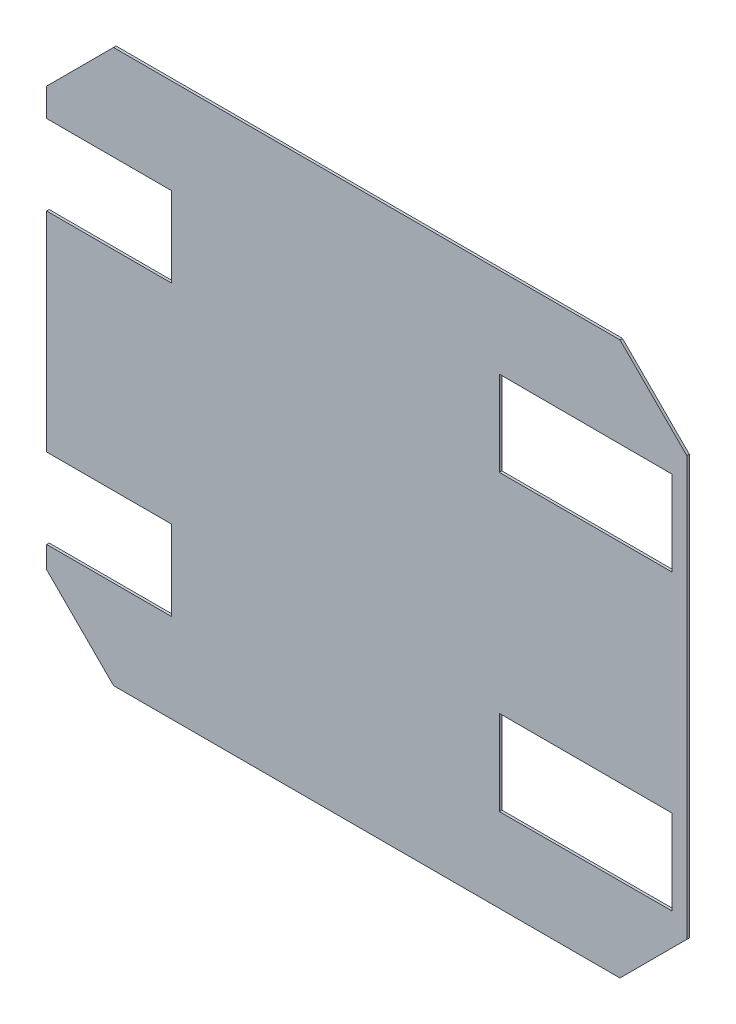
ISO-10303-21;
HEADER;
FILE_DESCRIPTION(('STEP AP214'),'2;1');
FILE_NAME('part.step','',(''),(''),'','','');
FILE_SCHEMA(('AUTOMOTIVE_DESIGN { 1 0 10303 214 1 1 1 1 }'));
ENDSEC;
DATA;
#1=APPLICATION_CONTEXT('core data for automotive mechanical design processes');
#2=APPLICATION_PROTOCOL_DEFINITION('international standard','automotive_design',2000,#1);
#3=PRODUCT_CONTEXT('',#1,'mechanical');
#4=PRODUCT('Part','Part','',(#3));
#5=PRODUCT_RELATED_PRODUCT_CATEGORY('part','',(#4));
#6=PRODUCT_DEFINITION_FORMATION('','',#4);
#7=PRODUCT_DEFINITION_CONTEXT('part definition',#1,'design');
#8=PRODUCT_DEFINITION('design','',#6,#7);
#9=PRODUCT_DEFINITION_SHAPE('','',#8);
#10=(LENGTH_UNIT() NAMED_UNIT(*) SI_UNIT(.MILLI.,.METRE.));
#11=(NAMED_UNIT(*) PLANE_ANGLE_UNIT() SI_UNIT($,.RADIAN.));
#12=(NAMED_UNIT(*) SI_UNIT($,.STERADIAN.) SOLID_ANGLE_UNIT());
#13=UNCERTAINTY_MEASURE_WITH_UNIT(LENGTH_MEASURE(1.E-05),#10,'distance_accuracy_value','');
#14=(GEOMETRIC_REPRESENTATION_CONTEXT(3) GLOBAL_UNCERTAINTY_ASSIGNED_CONTEXT((#13)) GLOBAL_UNIT_ASSIGNED_CONTEXT((#10,
#11,#12)) REPRESENTATION_CONTEXT('',''));
#15=CARTESIAN_POINT('',(0.,0.,0.));
#16=DIRECTION('',(0.,0.,1.));
#17=DIRECTION('',(1.,0.,0.));
#18=AXIS2_PLACEMENT_3D('',#15,#16,#17);
#19=CARTESIAN_POINT('',(110.112019193253,0.,2.));
#20=DIRECTION('',(-1.,0.,0.));
#21=DIRECTION('',(0.,-1.,0.));
#22=AXIS2_PLACEMENT_3D('',#19,#20,#21);
#23=PLANE('',#22);
#24=DIRECTION('',(0.,1.,0.));
#25=VECTOR('',#24,1.);
#26=CARTESIAN_POINT('',(110.112019193253,0.,0.));
#27=LINE('',#26,#25);
#28=CARTESIAN_POINT('',(110.112019193254,-113.938398775915,0.));
#29=VERTEX_POINT('',#28);
#30=CARTESIAN_POINT('',(110.112019193253,-46.168159055037,0.));
#31=VERTEX_POINT('',#30);
#32=EDGE_CURVE('E347',#29,#31,#27,.T.);
#33=ORIENTED_EDGE('',*,*,#32,.F.);
#34=DIRECTION('',(0.,0.,-1.));
#35=VECTOR('',#34,1.);
#36=CARTESIAN_POINT('',(110.112019193254,-113.938398775915,2.));
#37=LINE('',#36,#35);
#38=CARTESIAN_POINT('',(110.112019193254,-113.938398775915,2.));
#39=VERTEX_POINT('',#38);
#40=EDGE_CURVE('E11',#39,#29,#37,.T.);
#41=ORIENTED_EDGE('',*,*,#40,.F.);
#42=DIRECTION('',(0.,1.,0.));
#43=VECTOR('',#42,1.);
#44=CARTESIAN_POINT('',(110.112019193253,0.,2.));
#45=LINE('',#44,#43);
#46=CARTESIAN_POINT('',(110.112019193253,-46.168159055037,2.));
#47=VERTEX_POINT('',#46);
#48=EDGE_CURVE('E226',#39,#47,#45,.T.);
#49=ORIENTED_EDGE('',*,*,#48,.T.);
#50=DIRECTION('',(0.,0.,-1.));
#51=VECTOR('',#50,1.);
#52=CARTESIAN_POINT('',(110.112019193253,-46.168159055037,2.));
#53=LINE('',#52,#51);
#54=EDGE_CURVE('E144',#47,#31,#53,.T.);
#55=ORIENTED_EDGE('',*,*,#54,.T.);
#56=EDGE_LOOP('',(#33,#41,#49,#55));
#57=FACE_BOUND('',#56,.T.);
#58=ADVANCED_FACE('F43',(#57),#23,.T.);
#59=CARTESIAN_POINT('',(0.190004110785535,-114.121411187995,2.));
#60=DIRECTION('',(0.00166492725127887,-0.999998614007664,0.));
#61=DIRECTION('',(0.999998614007664,0.00166492725127887,0.));
#62=AXIS2_PLACEMENT_3D('',#59,#60,#61);
#63=PLANE('',#62);
#64=DIRECTION('',(-0.999998614007663,-0.00166492725127887,0.));
#65=VECTOR('',#64,1.);
#66=CARTESIAN_POINT('',(0.190004110785535,-114.121411187995,0.));
#67=LINE('',#66,#65);
#68=CARTESIAN_POINT('',(-27.8879808067465,-114.168159055037,0.));
#69=VERTEX_POINT('',#68);
#70=EDGE_CURVE('E231',#29,#69,#67,.T.);
#71=ORIENTED_EDGE('',*,*,#70,.T.);
#72=DIRECTION('',(0.,0.,-1.));
#73=VECTOR('',#72,1.);
#74=CARTESIAN_POINT('',(-27.8879808067465,-114.168159055037,2.));
#75=LINE('',#74,#73);
#76=CARTESIAN_POINT('',(-27.8879808067465,-114.168159055037,2.));
#77=VERTEX_POINT('',#76);
#78=EDGE_CURVE('E53',#77,#69,#75,.T.);
#79=ORIENTED_EDGE('',*,*,#78,.F.);
#80=DIRECTION('',(-0.999998614007663,-0.00166492725127887,0.));
#81=VECTOR('',#80,1.);
#82=CARTESIAN_POINT('',(0.190004110785535,-114.121411187995,2.));
#83=LINE('',#82,#81);
#84=EDGE_CURVE('E222',#39,#77,#83,.T.);
#85=ORIENTED_EDGE('',*,*,#84,.F.);
#86=ORIENTED_EDGE('',*,*,#40,.T.);
#87=EDGE_LOOP('',(#71,#79,#85,#86));
#88=FACE_BOUND('',#87,.T.);
#89=ADVANCED_FACE('F229',(#88),#63,.F.);
#90=CARTESIAN_POINT('',(-27.8879808067464,0.,2.));
#91=DIRECTION('',(-1.,0.,0.));
#92=DIRECTION('',(0.,-1.,0.));
#93=AXIS2_PLACEMENT_3D('',#90,#91,#92);
#94=PLANE('',#93);
#95=DIRECTION('',(0.,1.,0.));
#96=VECTOR('',#95,1.);
#97=CARTESIAN_POINT('',(-27.8879808067464,0.,0.));
#98=LINE('',#97,#96);
#99=CARTESIAN_POINT('',(-27.8879808067464,-46.168159055037,0.));
#100=VERTEX_POINT('',#99);
#101=EDGE_CURVE('E350',#69,#100,#98,.T.);
#102=ORIENTED_EDGE('',*,*,#101,.T.);
#103=DIRECTION('',(0.,0.,-1.));
#104=VECTOR('',#103,1.);
#105=CARTESIAN_POINT('',(-27.8879808067464,-46.168159055037,2.));
#106=LINE('',#105,#104);
#107=CARTESIAN_POINT('',(-27.8879808067464,-46.168159055037,2.));
#108=VERTEX_POINT('',#107);
#109=EDGE_CURVE('E221',#108,#100,#106,.T.);
#110=ORIENTED_EDGE('',*,*,#109,.F.);
#111=DIRECTION('',(0.,1.,0.));
#112=VECTOR('',#111,1.);
#113=CARTESIAN_POINT('',(-27.8879808067464,0.,2.));
#114=LINE('',#113,#112);
#115=EDGE_CURVE('E215',#77,#108,#114,.T.);
#116=ORIENTED_EDGE('',*,*,#115,.F.);
#117=ORIENTED_EDGE('',*,*,#78,.T.);
#118=EDGE_LOOP('',(#102,#110,#116,#117));
#119=FACE_BOUND('',#118,.T.);
#120=ADVANCED_FACE('F218',(#119),#94,.F.);
#121=CARTESIAN_POINT('',(0.314223050023848,188.730537188184,2.));
#122=DIRECTION('',(-0.00166492725127887,-0.999998614007664,0.));
#123=DIRECTION('',(0.999998614007664,-0.00166492725127887,0.));
#124=AXIS2_PLACEMENT_3D('',#121,#122,#123);
#125=PLANE('',#124);
#126=DIRECTION('',(-0.999998614007663,0.00166492725127887,0.));
#127=VECTOR('',#126,1.);
#128=CARTESIAN_POINT('',(0.314223050023848,188.730537188184,0.));
#129=LINE('',#128,#127);
#130=CARTESIAN_POINT('',(110.112019193254,188.547731591888,0.));
#131=VERTEX_POINT('',#130);
#132=CARTESIAN_POINT('',(-27.8879808067465,188.77749187101,0.));
#133=VERTEX_POINT('',#132);
#134=EDGE_CURVE('E335',#131,#133,#129,.T.);
#135=ORIENTED_EDGE('',*,*,#134,.F.);
#136=DIRECTION('',(0.,0.,-1.));
#137=VECTOR('',#136,1.);
#138=CARTESIAN_POINT('',(110.112019193254,188.547731591888,2.));
#139=LINE('',#138,#137);
#140=CARTESIAN_POINT('',(110.112019193254,188.547731591888,2.));
#141=VERTEX_POINT('',#140);
#142=EDGE_CURVE('E242',#141,#131,#139,.T.);
#143=ORIENTED_EDGE('',*,*,#142,.F.);
#144=DIRECTION('',(-0.999998614007663,0.00166492725127887,0.));
#145=VECTOR('',#144,1.);
#146=CARTESIAN_POINT('',(0.314223050023848,188.730537188184,2.));
#147=LINE('',#146,#145);
#148=CARTESIAN_POINT('',(-27.8879808067465,188.77749187101,2.));
#149=VERTEX_POINT('',#148);
#150=EDGE_CURVE('E387',#141,#149,#147,.T.);
#151=ORIENTED_EDGE('',*,*,#150,.T.);
#152=DIRECTION('',(0.,0.,-1.));
#153=VECTOR('',#152,1.);
#154=CARTESIAN_POINT('',(-27.8879808067465,188.77749187101,2.));
#155=LINE('',#154,#153);
#156=EDGE_CURVE('E236',#149,#133,#155,.T.);
#157=ORIENTED_EDGE('',*,*,#156,.T.);
#158=EDGE_LOOP('',(#135,#143,#151,#157));
#159=FACE_BOUND('',#158,.T.);
#160=ADVANCED_FACE('F428',(#159),#125,.T.);
#161=CARTESIAN_POINT('',(110.112019193253,0.,2.));
#162=DIRECTION('',(1.,0.,0.));
#163=DIRECTION('',(0.,1.,0.));
#164=AXIS2_PLACEMENT_3D('',#161,#162,#163);
#165=PLANE('',#164);
#166=DIRECTION('',(0.,-1.,0.));
#167=VECTOR('',#166,1.);
#168=CARTESIAN_POINT('',(110.112019193253,0.,0.));
#169=LINE('',#168,#167);
#170=CARTESIAN_POINT('',(110.112019193253,120.77749187101,0.));
#171=VERTEX_POINT('',#170);
#172=EDGE_CURVE('E338',#131,#171,#169,.T.);
#173=ORIENTED_EDGE('',*,*,#172,.T.);
#174=DIRECTION('',(0.,0.,-1.));
#175=VECTOR('',#174,1.);
#176=CARTESIAN_POINT('',(110.112019193253,120.77749187101,2.));
#177=LINE('',#176,#175);
#178=CARTESIAN_POINT('',(110.112019193253,120.77749187101,2.));
#179=VERTEX_POINT('',#178);
#180=EDGE_CURVE('E240',#179,#171,#177,.T.);
#181=ORIENTED_EDGE('',*,*,#180,.F.);
#182=DIRECTION('',(0.,-1.,0.));
#183=VECTOR('',#182,1.);
#184=CARTESIAN_POINT('',(110.112019193253,0.,2.));
#185=LINE('',#184,#183);
#186=EDGE_CURVE('E390',#141,#179,#185,.T.);
#187=ORIENTED_EDGE('',*,*,#186,.F.);
#188=ORIENTED_EDGE('',*,*,#142,.T.);
#189=EDGE_LOOP('',(#173,#181,#187,#188));
#190=FACE_BOUND('',#189,.T.);
#191=ADVANCED_FACE('F425',(#190),#165,.F.);
#192=CARTESIAN_POINT('',(0.,120.77749187101,2.));
#193=DIRECTION('',(0.,1.,0.));
#194=DIRECTION('',(-1.,0.,0.));
#195=AXIS2_PLACEMENT_3D('',#192,#193,#194);
#196=PLANE('',#195);
#197=DIRECTION('',(1.,0.,0.));
#198=VECTOR('',#197,1.);
#199=CARTESIAN_POINT('',(0.,120.77749187101,0.));
#200=LINE('',#199,#198);
#201=CARTESIAN_POINT('',(-27.8879808067464,120.77749187101,0.));
#202=VERTEX_POINT('',#201);
#203=EDGE_CURVE('E341',#202,#171,#200,.T.);
#204=ORIENTED_EDGE('',*,*,#203,.F.);
#205=DIRECTION('',(0.,0.,-1.));
#206=VECTOR('',#205,1.);
#207=CARTESIAN_POINT('',(-27.8879808067464,120.77749187101,2.));
#208=LINE('',#207,#206);
#209=CARTESIAN_POINT('',(-27.8879808067464,120.77749187101,2.));
#210=VERTEX_POINT('',#209);
#211=EDGE_CURVE('E238',#210,#202,#208,.T.);
#212=ORIENTED_EDGE('',*,*,#211,.F.);
#213=DIRECTION('',(1.,0.,0.));
#214=VECTOR('',#213,1.);
#215=CARTESIAN_POINT('',(0.,120.77749187101,2.));
#216=LINE('',#215,#214);
#217=EDGE_CURVE('E392',#210,#179,#216,.T.);
#218=ORIENTED_EDGE('',*,*,#217,.T.);
#219=ORIENTED_EDGE('',*,*,#180,.T.);
#220=EDGE_LOOP('',(#204,#212,#218,#219));
#221=FACE_BOUND('',#220,.T.);
#222=ADVANCED_FACE('F423',(#221),#196,.T.);
#223=CARTESIAN_POINT('',(0.,-110.168159055037,2.));
#224=DIRECTION('',(0.,1.,0.));
#225=DIRECTION('',(0.,0.,1.));
#226=AXIS2_PLACEMENT_3D('',#223,#224,#225);
#227=PLANE('',#226);
#228=DIRECTION('',(1.,0.,0.));
#229=VECTOR('',#228,1.);
#230=CARTESIAN_POINT('',(0.,-110.168159055037,0.));
#231=LINE('',#230,#229);
#232=CARTESIAN_POINT('',(-389.887980806746,-110.168159055037,0.));
#233=VERTEX_POINT('',#232);
#234=CARTESIAN_POINT('',(-289.887980806746,-110.168159055037,0.));
#235=VERTEX_POINT('',#234);
#236=EDGE_CURVE('E299',#233,#235,#231,.T.);
#237=ORIENTED_EDGE('',*,*,#236,.F.);
#238=DIRECTION('',(0.,0.,-1.));
#239=VECTOR('',#238,1.);
#240=CARTESIAN_POINT('',(-389.887980806746,-110.168159055037,2.));
#241=LINE('',#240,#239);
#242=CARTESIAN_POINT('',(-389.887980806746,-110.168159055037,2.));
#243=VERTEX_POINT('',#242);
#244=EDGE_CURVE('E47',#243,#233,#241,.T.);
#245=ORIENTED_EDGE('',*,*,#244,.F.);
#246=DIRECTION('',(1.,0.,0.));
#247=VECTOR('',#246,1.);
#248=CARTESIAN_POINT('',(0.,-110.168159055037,2.));
#249=LINE('',#248,#247);
#250=CARTESIAN_POINT('',(-289.887980806746,-110.168159055037,2.));
#251=VERTEX_POINT('',#250);
#252=EDGE_CURVE('E352',#243,#251,#249,.T.);
#253=ORIENTED_EDGE('',*,*,#252,.T.);
#254=DIRECTION('',(0.,0.,-1.));
#255=VECTOR('',#254,1.);
#256=CARTESIAN_POINT('',(-289.887980806746,-110.168159055037,2.));
#257=LINE('',#256,#255);
#258=EDGE_CURVE('E244',#251,#235,#257,.T.);
#259=ORIENTED_EDGE('',*,*,#258,.T.);
#260=EDGE_LOOP('',(#237,#245,#253,#259));
#261=FACE_BOUND('',#260,.T.);
#262=ADVANCED_FACE('F45',(#261),#227,.T.);
#263=CARTESIAN_POINT('',(-389.887980806746,0.,2.));
#264=DIRECTION('',(1.,0.,0.));
#265=DIRECTION('',(0.,0.,-1.));
#266=AXIS2_PLACEMENT_3D('',#263,#264,#265);
#267=PLANE('',#266);
#268=DIRECTION('',(0.,-1.,0.));
#269=VECTOR('',#268,1.);
#270=CARTESIAN_POINT('',(-389.887980806746,0.,0.));
#271=LINE('',#270,#269);
#272=CARTESIAN_POINT('',(-389.887980806746,-127.707789503228,0.));
#273=VERTEX_POINT('',#272);
#274=EDGE_CURVE('E291',#233,#273,#271,.T.);
#275=ORIENTED_EDGE('',*,*,#274,.T.);
#276=DIRECTION('',(0.,0.,-1.));
#277=VECTOR('',#276,1.);
#278=CARTESIAN_POINT('',(-389.887980806746,-127.707789503228,2.));
#279=LINE('',#278,#277);
#280=CARTESIAN_POINT('',(-389.887980806746,-127.707789503228,2.));
#281=VERTEX_POINT('',#280);
#282=EDGE_CURVE('E282',#281,#273,#279,.T.);
#283=ORIENTED_EDGE('',*,*,#282,.F.);
#284=DIRECTION('',(0.,-1.,0.));
#285=VECTOR('',#284,1.);
#286=CARTESIAN_POINT('',(-389.887980806746,0.,2.));
#287=LINE('',#286,#285);
#288=EDGE_CURVE('E292',#243,#281,#287,.T.);
#289=ORIENTED_EDGE('',*,*,#288,.F.);
#290=ORIENTED_EDGE('',*,*,#244,.T.);
#291=EDGE_LOOP('',(#275,#283,#289,#290));
#292=FACE_BOUND('',#291,.T.);
#293=ADVANCED_FACE('F290',(#292),#267,.F.);
#294=CARTESIAN_POINT('',(-258.797885154987,-258.797885154987,2.));
#295=DIRECTION('',(0.707106781186547,0.707106781186548,0.));
#296=DIRECTION('',(-0.707106781186548,0.707106781186547,0.));
#297=AXIS2_PLACEMENT_3D('',#294,#295,#296);
#298=PLANE('',#297);
#299=DIRECTION('',(0.707106781186548,-0.707106781186547,0.));
#300=VECTOR('',#299,1.);
#301=CARTESIAN_POINT('',(-258.797885154987,-258.797885154987,0.));
#302=LINE('',#301,#300);
#303=CARTESIAN_POINT('',(-336.373262180985,-181.22250812899,0.));
#304=VERTEX_POINT('',#303);
#305=EDGE_CURVE('E302',#273,#304,#302,.T.);
#306=ORIENTED_EDGE('',*,*,#305,.T.);
#307=DIRECTION('',(0.,0.,-1.));
#308=VECTOR('',#307,1.);
#309=CARTESIAN_POINT('',(-336.373262180985,-181.22250812899,2.));
#310=LINE('',#309,#308);
#311=CARTESIAN_POINT('',(-336.373262180985,-181.22250812899,2.));
#312=VERTEX_POINT('',#311);
#313=EDGE_CURVE('E280',#312,#304,#310,.T.);
#314=ORIENTED_EDGE('',*,*,#313,.F.);
#315=DIRECTION('',(0.707106781186548,-0.707106781186547,0.));
#316=VECTOR('',#315,1.);
#317=CARTESIAN_POINT('',(-258.797885154987,-258.797885154987,2.));
#318=LINE('',#317,#316);
#319=EDGE_CURVE('E356',#281,#312,#318,.T.);
#320=ORIENTED_EDGE('',*,*,#319,.F.);
#321=ORIENTED_EDGE('',*,*,#282,.T.);
#322=EDGE_LOOP('',(#306,#314,#320,#321));
#323=FACE_BOUND('',#322,.T.);
#324=ADVANCED_FACE('F481',(#323),#298,.F.);
#325=CARTESIAN_POINT('',(0.,-181.22250812899,2.));
#326=DIRECTION('',(0.,1.,0.));
#327=DIRECTION('',(0.,0.,1.));
#328=AXIS2_PLACEMENT_3D('',#325,#326,#327);
#329=PLANE('',#328);
#330=DIRECTION('',(1.,0.,0.));
#331=VECTOR('',#330,1.);
#332=CARTESIAN_POINT('',(0.,-181.22250812899,0.));
#333=LINE('',#332,#331);
#334=CARTESIAN_POINT('',(68.597300567492,-181.22250812899,0.));
#335=VERTEX_POINT('',#334);
#336=EDGE_CURVE('E309',#304,#335,#333,.T.);
#337=ORIENTED_EDGE('',*,*,#336,.T.);
#338=DIRECTION('',(0.,0.,-1.));
#339=VECTOR('',#338,1.);
#340=CARTESIAN_POINT('',(68.597300567492,-181.22250812899,2.));
#341=LINE('',#340,#339);
#342=CARTESIAN_POINT('',(68.597300567492,-181.22250812899,2.));
#343=VERTEX_POINT('',#342);
#344=EDGE_CURVE('E277',#343,#335,#341,.T.);
#345=ORIENTED_EDGE('',*,*,#344,.F.);
#346=DIRECTION('',(1.,0.,0.));
#347=VECTOR('',#346,1.);
#348=CARTESIAN_POINT('',(0.,-181.22250812899,2.));
#349=LINE('',#348,#347);
#350=EDGE_CURVE('E361',#312,#343,#349,.T.);
#351=ORIENTED_EDGE('',*,*,#350,.F.);
#352=ORIENTED_EDGE('',*,*,#313,.T.);
#353=EDGE_LOOP('',(#337,#345,#351,#352));
#354=FACE_BOUND('',#353,.T.);
#355=ADVANCED_FACE('F478',(#354),#329,.F.);
#356=CARTESIAN_POINT('',(124.909904348241,-124.909904348241,2.));
#357=DIRECTION('',(-0.707106781186547,0.707106781186547,0.));
#358=DIRECTION('',(-0.707106781186548,-0.707106781186548,0.));
#359=AXIS2_PLACEMENT_3D('',#356,#357,#358);
#360=PLANE('',#359);
#361=DIRECTION('',(0.707106781186548,0.707106781186548,0.));
#362=VECTOR('',#361,1.);
#363=CARTESIAN_POINT('',(124.909904348241,-124.909904348241,0.));
#364=LINE('',#363,#362);
#365=CARTESIAN_POINT('',(122.112019193253,-127.707789503228,0.));
#366=VERTEX_POINT('',#365);
#367=EDGE_CURVE('E311',#335,#366,#364,.T.);
#368=ORIENTED_EDGE('',*,*,#367,.T.);
#369=DIRECTION('',(0.,0.,-1.));
#370=VECTOR('',#369,1.);
#371=CARTESIAN_POINT('',(122.112019193253,-127.707789503228,2.));
#372=LINE('',#371,#370);
#373=CARTESIAN_POINT('',(122.112019193253,-127.707789503228,2.));
#374=VERTEX_POINT('',#373);
#375=EDGE_CURVE('E274',#374,#366,#372,.T.);
#376=ORIENTED_EDGE('',*,*,#375,.F.);
#377=DIRECTION('',(0.707106781186548,0.707106781186548,0.));
#378=VECTOR('',#377,1.);
#379=CARTESIAN_POINT('',(124.909904348241,-124.909904348241,2.));
#380=LINE('',#379,#378);
#381=EDGE_CURVE('E363',#343,#374,#380,.T.);
#382=ORIENTED_EDGE('',*,*,#381,.F.);
#383=ORIENTED_EDGE('',*,*,#344,.T.);
#384=EDGE_LOOP('',(#368,#376,#382,#383));
#385=FACE_BOUND('',#384,.T.);
#386=ADVANCED_FACE('F474',(#385),#360,.F.);
#387=CARTESIAN_POINT('',(122.112019193253,0.,2.));
#388=DIRECTION('',(-1.,0.,0.));
#389=DIRECTION('',(0.,0.,1.));
#390=AXIS2_PLACEMENT_3D('',#387,#388,#389);
#391=PLANE('',#390);
#392=DIRECTION('',(0.,1.,0.));
#393=VECTOR('',#392,1.);
#394=CARTESIAN_POINT('',(122.112019193253,0.,0.));
#395=LINE('',#394,#393);
#396=CARTESIAN_POINT('',(122.112019193253,207.262773245249,0.));
#397=VERTEX_POINT('',#396);
#398=EDGE_CURVE('E313',#366,#397,#395,.T.);
#399=ORIENTED_EDGE('',*,*,#398,.T.);
#400=DIRECTION('',(0.,0.,-1.));
#401=VECTOR('',#400,1.);
#402=CARTESIAN_POINT('',(122.112019193253,207.262773245249,2.));
#403=LINE('',#402,#401);
#404=CARTESIAN_POINT('',(122.112019193253,207.262773245249,2.));
#405=VERTEX_POINT('',#404);
#406=EDGE_CURVE('E271',#405,#397,#403,.T.);
#407=ORIENTED_EDGE('',*,*,#406,.F.);
#408=DIRECTION('',(0.,1.,0.));
#409=VECTOR('',#408,1.);
#410=CARTESIAN_POINT('',(122.112019193253,0.,2.));
#411=LINE('',#410,#409);
#412=EDGE_CURVE('E365',#374,#405,#411,.T.);
#413=ORIENTED_EDGE('',*,*,#412,.F.);
#414=ORIENTED_EDGE('',*,*,#375,.T.);
#415=EDGE_LOOP('',(#399,#407,#413,#414));
#416=FACE_BOUND('',#415,.T.);
#417=ADVANCED_FACE('F470',(#416),#391,.F.);
#418=CARTESIAN_POINT('',(164.687396219251,164.687396219251,2.));
#419=DIRECTION('',(-0.707106781186547,-0.707106781186548,0.));
#420=DIRECTION('',(0.707106781186548,-0.707106781186547,0.));
#421=AXIS2_PLACEMENT_3D('',#418,#419,#420);
#422=PLANE('',#421);
#423=DIRECTION('',(-0.707106781186548,0.707106781186547,0.));
#424=VECTOR('',#423,1.);
#425=CARTESIAN_POINT('',(164.687396219251,164.687396219251,0.));
#426=LINE('',#425,#424);
#427=CARTESIAN_POINT('',(68.5973005674921,260.77749187101,0.));
#428=VERTEX_POINT('',#427);
#429=EDGE_CURVE('E315',#397,#428,#426,.T.);
#430=ORIENTED_EDGE('',*,*,#429,.T.);
#431=DIRECTION('',(0.,0.,-1.));
#432=VECTOR('',#431,1.);
#433=CARTESIAN_POINT('',(68.5973005674921,260.77749187101,2.));
#434=LINE('',#433,#432);
#435=CARTESIAN_POINT('',(68.5973005674921,260.77749187101,2.));
#436=VERTEX_POINT('',#435);
#437=EDGE_CURVE('E268',#436,#428,#434,.T.);
#438=ORIENTED_EDGE('',*,*,#437,.F.);
#439=DIRECTION('',(-0.707106781186548,0.707106781186547,0.));
#440=VECTOR('',#439,1.);
#441=CARTESIAN_POINT('',(164.687396219251,164.687396219251,2.));
#442=LINE('',#441,#440);
#443=EDGE_CURVE('E367',#405,#436,#442,.T.);
#444=ORIENTED_EDGE('',*,*,#443,.F.);
#445=ORIENTED_EDGE('',*,*,#406,.T.);
#446=EDGE_LOOP('',(#430,#438,#444,#445));
#447=FACE_BOUND('',#446,.T.);
#448=ADVANCED_FACE('F466',(#447),#422,.F.);
#449=CARTESIAN_POINT('',(0.,260.77749187101,2.));
#450=DIRECTION('',(0.,-1.,0.));
#451=DIRECTION('',(0.,0.,-1.));
#452=AXIS2_PLACEMENT_3D('',#449,#450,#451);
#453=PLANE('',#452);
#454=DIRECTION('',(-1.,0.,0.));
#455=VECTOR('',#454,1.);
#456=CARTESIAN_POINT('',(0.,260.77749187101,0.));
#457=LINE('',#456,#455);
#458=CARTESIAN_POINT('',(-336.373262180985,260.77749187101,0.));
#459=VERTEX_POINT('',#458);
#460=EDGE_CURVE('E317',#428,#459,#457,.T.);
#461=ORIENTED_EDGE('',*,*,#460,.T.);
#462=DIRECTION('',(0.,0.,-1.));
#463=VECTOR('',#462,1.);
#464=CARTESIAN_POINT('',(-336.373262180985,260.77749187101,2.));
#465=LINE('',#464,#463);
#466=CARTESIAN_POINT('',(-336.373262180985,260.77749187101,2.));
#467=VERTEX_POINT('',#466);
#468=EDGE_CURVE('E265',#467,#459,#465,.T.);
#469=ORIENTED_EDGE('',*,*,#468,.F.);
#470=DIRECTION('',(-1.,0.,0.));
#471=VECTOR('',#470,1.);
#472=CARTESIAN_POINT('',(0.,260.77749187101,2.));
#473=LINE('',#472,#471);
#474=EDGE_CURVE('E369',#436,#467,#473,.T.);
#475=ORIENTED_EDGE('',*,*,#474,.F.);
#476=ORIENTED_EDGE('',*,*,#437,.T.);
#477=EDGE_LOOP('',(#461,#469,#475,#476));
#478=FACE_BOUND('',#477,.T.);
#479=ADVANCED_FACE('F462',(#478),#453,.F.);
#480=CARTESIAN_POINT('',(-298.575377025998,298.575377025998,2.));
#481=DIRECTION('',(0.707106781186547,-0.707106781186548,0.));
#482=DIRECTION('',(0.707106781186548,0.707106781186547,0.));
#483=AXIS2_PLACEMENT_3D('',#480,#481,#482);
#484=PLANE('',#483);
#485=DIRECTION('',(-0.707106781186548,-0.707106781186547,0.));
#486=VECTOR('',#485,1.);
#487=CARTESIAN_POINT('',(-298.575377025998,298.575377025998,0.));
#488=LINE('',#487,#486);
#489=CARTESIAN_POINT('',(-389.887980806746,207.262773245249,0.));
#490=VERTEX_POINT('',#489);
#491=EDGE_CURVE('E319',#459,#490,#488,.T.);
#492=ORIENTED_EDGE('',*,*,#491,.T.);
#493=DIRECTION('',(0.,0.,-1.));
#494=VECTOR('',#493,1.);
#495=CARTESIAN_POINT('',(-389.887980806746,207.262773245249,2.));
#496=LINE('',#495,#494);
#497=CARTESIAN_POINT('',(-389.887980806746,207.262773245249,2.));
#498=VERTEX_POINT('',#497);
#499=EDGE_CURVE('E262',#498,#490,#496,.T.);
#500=ORIENTED_EDGE('',*,*,#499,.F.);
#501=DIRECTION('',(-0.707106781186548,-0.707106781186547,0.));
#502=VECTOR('',#501,1.);
#503=CARTESIAN_POINT('',(-298.575377025998,298.575377025998,2.));
#504=LINE('',#503,#502);
#505=EDGE_CURVE('E371',#467,#498,#504,.T.);
#506=ORIENTED_EDGE('',*,*,#505,.F.);
#507=ORIENTED_EDGE('',*,*,#468,.T.);
#508=EDGE_LOOP('',(#492,#500,#506,#507));
#509=FACE_BOUND('',#508,.T.);
#510=ADVANCED_FACE('F458',(#509),#484,.F.);
#511=CARTESIAN_POINT('',(-389.887980806746,184.77749187101,0.));
#512=VERTEX_POINT('',#511);
#513=EDGE_CURVE('E304',#490,#512,#271,.T.);
#514=ORIENTED_EDGE('',*,*,#513,.T.);
#515=DIRECTION('',(0.,0.,-1.));
#516=VECTOR('',#515,1.);
#517=CARTESIAN_POINT('',(-389.887980806746,184.77749187101,2.));
#518=LINE('',#517,#516);
#519=CARTESIAN_POINT('',(-389.887980806746,184.77749187101,2.));
#520=VERTEX_POINT('',#519);
#521=EDGE_CURVE('E259',#520,#512,#518,.T.);
#522=ORIENTED_EDGE('',*,*,#521,.F.);
#523=EDGE_CURVE('E358',#498,#520,#287,.T.);
#524=ORIENTED_EDGE('',*,*,#523,.F.);
#525=ORIENTED_EDGE('',*,*,#499,.T.);
#526=EDGE_LOOP('',(#514,#522,#524,#525));
#527=FACE_BOUND('',#526,.T.);
#528=ADVANCED_FACE('F454',(#527),#267,.F.);
#529=CARTESIAN_POINT('',(0.,184.77749187101,2.));
#530=DIRECTION('',(0.,1.,0.));
#531=DIRECTION('',(0.,0.,1.));
#532=AXIS2_PLACEMENT_3D('',#529,#530,#531);
#533=PLANE('',#532);
#534=DIRECTION('',(1.,0.,0.));
#535=VECTOR('',#534,1.);
#536=CARTESIAN_POINT('',(0.,184.77749187101,0.));
#537=LINE('',#536,#535);
#538=CARTESIAN_POINT('',(-289.887980806746,184.77749187101,0.));
#539=VERTEX_POINT('',#538);
#540=EDGE_CURVE('E321',#512,#539,#537,.T.);
#541=ORIENTED_EDGE('',*,*,#540,.T.);
#542=DIRECTION('',(0.,0.,-1.));
#543=VECTOR('',#542,1.);
#544=CARTESIAN_POINT('',(-289.887980806746,184.77749187101,2.));
#545=LINE('',#544,#543);
#546=CARTESIAN_POINT('',(-289.887980806746,184.77749187101,2.));
#547=VERTEX_POINT('',#546);
#548=EDGE_CURVE('E256',#547,#539,#545,.T.);
#549=ORIENTED_EDGE('',*,*,#548,.F.);
#550=DIRECTION('',(1.,0.,0.));
#551=VECTOR('',#550,1.);
#552=CARTESIAN_POINT('',(0.,184.77749187101,2.));
#553=LINE('',#552,#551);
#554=EDGE_CURVE('E373',#520,#547,#553,.T.);
#555=ORIENTED_EDGE('',*,*,#554,.F.);
#556=ORIENTED_EDGE('',*,*,#521,.T.);
#557=EDGE_LOOP('',(#541,#549,#555,#556));
#558=FACE_BOUND('',#557,.T.);
#559=ADVANCED_FACE('F450',(#558),#533,.F.);
#560=CARTESIAN_POINT('',(-289.887980806746,0.,2.));
#561=DIRECTION('',(1.,0.,0.));
#562=DIRECTION('',(0.,0.,-1.));
#563=AXIS2_PLACEMENT_3D('',#560,#561,#562);
#564=PLANE('',#563);
#565=DIRECTION('',(0.,-1.,0.));
#566=VECTOR('',#565,1.);
#567=CARTESIAN_POINT('',(-289.887980806746,0.,0.));
#568=LINE('',#567,#566);
#569=CARTESIAN_POINT('',(-289.887980806746,120.77749187101,0.));
#570=VERTEX_POINT('',#569);
#571=EDGE_CURVE('E323',#539,#570,#568,.T.);
#572=ORIENTED_EDGE('',*,*,#571,.T.);
#573=DIRECTION('',(0.,0.,-1.));
#574=VECTOR('',#573,1.);
#575=CARTESIAN_POINT('',(-289.887980806746,120.77749187101,2.));
#576=LINE('',#575,#574);
#577=CARTESIAN_POINT('',(-289.887980806746,120.77749187101,2.));
#578=VERTEX_POINT('',#577);
#579=EDGE_CURVE('E253',#578,#570,#576,.T.);
#580=ORIENTED_EDGE('',*,*,#579,.F.);
#581=DIRECTION('',(0.,-1.,0.));
#582=VECTOR('',#581,1.);
#583=CARTESIAN_POINT('',(-289.887980806746,0.,2.));
#584=LINE('',#583,#582);
#585=EDGE_CURVE('E375',#547,#578,#584,.T.);
#586=ORIENTED_EDGE('',*,*,#585,.F.);
#587=ORIENTED_EDGE('',*,*,#548,.T.);
#588=EDGE_LOOP('',(#572,#580,#586,#587));
#589=FACE_BOUND('',#588,.T.);
#590=ADVANCED_FACE('F446',(#589),#564,.F.);
#591=CARTESIAN_POINT('',(0.,120.77749187101,2.));
#592=DIRECTION('',(0.,-1.,0.));
#593=DIRECTION('',(1.,0.,0.));
#594=AXIS2_PLACEMENT_3D('',#591,#592,#593);
#595=PLANE('',#594);
#596=DIRECTION('',(-1.,0.,0.));
#597=VECTOR('',#596,1.);
#598=CARTESIAN_POINT('',(0.,120.77749187101,0.));
#599=LINE('',#598,#597);
#600=CARTESIAN_POINT('',(-389.887980806746,120.77749187101,0.));
#601=VERTEX_POINT('',#600);
#602=EDGE_CURVE('E325',#570,#601,#599,.T.);
#603=ORIENTED_EDGE('',*,*,#602,.T.);
#604=DIRECTION('',(0.,0.,-1.));
#605=VECTOR('',#604,1.);
#606=CARTESIAN_POINT('',(-389.887980806746,120.77749187101,2.));
#607=LINE('',#606,#605);
#608=CARTESIAN_POINT('',(-389.887980806746,120.77749187101,2.));
#609=VERTEX_POINT('',#608);
#610=EDGE_CURVE('E250',#609,#601,#607,.T.);
#611=ORIENTED_EDGE('',*,*,#610,.F.);
#612=DIRECTION('',(-1.,0.,0.));
#613=VECTOR('',#612,1.);
#614=CARTESIAN_POINT('',(0.,120.77749187101,2.));
#615=LINE('',#614,#613);
#616=EDGE_CURVE('E377',#578,#609,#615,.T.);
#617=ORIENTED_EDGE('',*,*,#616,.F.);
#618=ORIENTED_EDGE('',*,*,#579,.T.);
#619=EDGE_LOOP('',(#603,#611,#617,#618));
#620=FACE_BOUND('',#619,.T.);
#621=ADVANCED_FACE('F442',(#620),#595,.F.);
#622=CARTESIAN_POINT('',(-389.887980806746,0.,2.));
#623=DIRECTION('',(1.,0.,0.));
#624=DIRECTION('',(0.,0.,-1.));
#625=AXIS2_PLACEMENT_3D('',#622,#623,#624);
#626=PLANE('',#625);
#627=DIRECTION('',(0.,-1.,0.));
#628=VECTOR('',#627,1.);
#629=CARTESIAN_POINT('',(-389.887980806746,0.,0.));
#630=LINE('',#629,#628);
#631=CARTESIAN_POINT('',(-389.887980806746,-46.168159055037,0.));
#632=VERTEX_POINT('',#631);
#633=EDGE_CURVE('E327',#601,#632,#630,.T.);
#634=ORIENTED_EDGE('',*,*,#633,.T.);
#635=DIRECTION('',(0.,0.,-1.));
#636=VECTOR('',#635,1.);
#637=CARTESIAN_POINT('',(-389.887980806746,-46.168159055037,2.));
#638=LINE('',#637,#636);
#639=CARTESIAN_POINT('',(-389.887980806746,-46.168159055037,2.));
#640=VERTEX_POINT('',#639);
#641=EDGE_CURVE('E248',#640,#632,#638,.T.);
#642=ORIENTED_EDGE('',*,*,#641,.F.);
#643=DIRECTION('',(0.,-1.,0.));
#644=VECTOR('',#643,1.);
#645=CARTESIAN_POINT('',(-389.887980806746,0.,2.));
#646=LINE('',#645,#644);
#647=EDGE_CURVE('E379',#609,#640,#646,.T.);
#648=ORIENTED_EDGE('',*,*,#647,.F.);
#649=ORIENTED_EDGE('',*,*,#610,.T.);
#650=EDGE_LOOP('',(#634,#642,#648,#649));
#651=FACE_BOUND('',#650,.T.);
#652=ADVANCED_FACE('F438',(#651),#626,.F.);
#653=CARTESIAN_POINT('',(0.,-46.168159055037,2.));
#654=DIRECTION('',(0.,-1.,0.));
#655=DIRECTION('',(1.,0.,0.));
#656=AXIS2_PLACEMENT_3D('',#653,#654,#655);
#657=PLANE('',#656);
#658=DIRECTION('',(-1.,0.,0.));
#659=VECTOR('',#658,1.);
#660=CARTESIAN_POINT('',(0.,-46.168159055037,0.));
#661=LINE('',#660,#659);
#662=CARTESIAN_POINT('',(-289.887980806746,-46.168159055037,0.));
#663=VERTEX_POINT('',#662);
#664=EDGE_CURVE('E330',#663,#632,#661,.T.);
#665=ORIENTED_EDGE('',*,*,#664,.F.);
#666=DIRECTION('',(0.,0.,-1.));
#667=VECTOR('',#666,1.);
#668=CARTESIAN_POINT('',(-289.887980806746,-46.168159055037,2.));
#669=LINE('',#668,#667);
#670=CARTESIAN_POINT('',(-289.887980806746,-46.168159055037,2.));
#671=VERTEX_POINT('',#670);
#672=EDGE_CURVE('E246',#671,#663,#669,.T.);
#673=ORIENTED_EDGE('',*,*,#672,.F.);
#674=DIRECTION('',(-1.,0.,0.));
#675=VECTOR('',#674,1.);
#676=CARTESIAN_POINT('',(0.,-46.168159055037,2.));
#677=LINE('',#676,#675);
#678=EDGE_CURVE('E381',#671,#640,#677,.T.);
#679=ORIENTED_EDGE('',*,*,#678,.T.);
#680=ORIENTED_EDGE('',*,*,#641,.T.);
#681=EDGE_LOOP('',(#665,#673,#679,#680));
#682=FACE_BOUND('',#681,.T.);
#683=ADVANCED_FACE('F421',(#682),#657,.T.);
#684=CARTESIAN_POINT('',(-27.8879808067464,0.,2.));
#685=DIRECTION('',(1.,0.,0.));
#686=DIRECTION('',(0.,1.,0.));
#687=AXIS2_PLACEMENT_3D('',#684,#685,#686);
#688=PLANE('',#687);
#689=DIRECTION('',(0.,-1.,0.));
#690=VECTOR('',#689,1.);
#691=CARTESIAN_POINT('',(-27.8879808067464,0.,0.));
#692=LINE('',#691,#690);
#693=EDGE_CURVE('E344',#133,#202,#692,.T.);
#694=ORIENTED_EDGE('',*,*,#693,.F.);
#695=ORIENTED_EDGE('',*,*,#156,.F.);
#696=DIRECTION('',(0.,-1.,0.));
#697=VECTOR('',#696,1.);
#698=CARTESIAN_POINT('',(-27.8879808067464,0.,2.));
#699=LINE('',#698,#697);
#700=EDGE_CURVE('E395',#149,#210,#699,.T.);
#701=ORIENTED_EDGE('',*,*,#700,.T.);
#702=ORIENTED_EDGE('',*,*,#211,.T.);
#703=EDGE_LOOP('',(#694,#695,#701,#702));
#704=FACE_BOUND('',#703,.T.);
#705=ADVANCED_FACE('F417',(#704),#688,.T.);
#706=CARTESIAN_POINT('',(-289.887980806746,0.,2.));
#707=DIRECTION('',(-1.,0.,0.));
#708=DIRECTION('',(0.,0.,1.));
#709=AXIS2_PLACEMENT_3D('',#706,#707,#708);
#710=PLANE('',#709);
#711=DIRECTION('',(0.,1.,0.));
#712=VECTOR('',#711,1.);
#713=CARTESIAN_POINT('',(-289.887980806746,0.,0.));
#714=LINE('',#713,#712);
#715=EDGE_CURVE('E333',#235,#663,#714,.T.);
#716=ORIENTED_EDGE('',*,*,#715,.F.);
#717=ORIENTED_EDGE('',*,*,#258,.F.);
#718=DIRECTION('',(0.,1.,0.));
#719=VECTOR('',#718,1.);
#720=CARTESIAN_POINT('',(-289.887980806746,0.,2.));
#721=LINE('',#720,#719);
#722=EDGE_CURVE('E384',#251,#671,#721,.T.);
#723=ORIENTED_EDGE('',*,*,#722,.T.);
#724=ORIENTED_EDGE('',*,*,#672,.T.);
#725=EDGE_LOOP('',(#716,#717,#723,#724));
#726=FACE_BOUND('',#725,.T.);
#727=ADVANCED_FACE('F420',(#726),#710,.T.);
#728=CARTESIAN_POINT('',(0.,-46.168159055037,2.));
#729=DIRECTION('',(0.,1.,0.));
#730=DIRECTION('',(-1.,0.,0.));
#731=AXIS2_PLACEMENT_3D('',#728,#729,#730);
#732=PLANE('',#731);
#733=DIRECTION('',(1.,0.,0.));
#734=VECTOR('',#733,1.);
#735=CARTESIAN_POINT('',(0.,-46.168159055037,0.));
#736=LINE('',#735,#734);
#737=EDGE_CURVE('E137',#100,#31,#736,.T.);
#738=ORIENTED_EDGE('',*,*,#737,.T.);
#739=ORIENTED_EDGE('',*,*,#54,.F.);
#740=DIRECTION('',(1.,0.,0.));
#741=VECTOR('',#740,1.);
#742=CARTESIAN_POINT('',(0.,-46.168159055037,2.));
#743=LINE('',#742,#741);
#744=EDGE_CURVE('E62',#108,#47,#743,.T.);
#745=ORIENTED_EDGE('',*,*,#744,.F.);
#746=ORIENTED_EDGE('',*,*,#109,.T.);
#747=EDGE_LOOP('',(#738,#739,#745,#746));
#748=FACE_BOUND('',#747,.T.);
#749=ADVANCED_FACE('F403',(#748),#732,.F.);
#750=CARTESIAN_POINT('',(0.,0.,2.));
#751=DIRECTION('',(0.,0.,1.));
#752=DIRECTION('',(1.,0.,0.));
#753=AXIS2_PLACEMENT_3D('',#750,#751,#752);
#754=PLANE('',#753);
#755=ORIENTED_EDGE('',*,*,#252,.F.);
#756=ORIENTED_EDGE('',*,*,#288,.T.);
#757=ORIENTED_EDGE('',*,*,#319,.T.);
#758=ORIENTED_EDGE('',*,*,#350,.T.);
#759=ORIENTED_EDGE('',*,*,#381,.T.);
#760=ORIENTED_EDGE('',*,*,#412,.T.);
#761=ORIENTED_EDGE('',*,*,#443,.T.);
#762=ORIENTED_EDGE('',*,*,#474,.T.);
#763=ORIENTED_EDGE('',*,*,#505,.T.);
#764=ORIENTED_EDGE('',*,*,#523,.T.);
#765=ORIENTED_EDGE('',*,*,#554,.T.);
#766=ORIENTED_EDGE('',*,*,#585,.T.);
#767=ORIENTED_EDGE('',*,*,#616,.T.);
#768=ORIENTED_EDGE('',*,*,#647,.T.);
#769=ORIENTED_EDGE('',*,*,#678,.F.);
#770=ORIENTED_EDGE('',*,*,#722,.F.);
#771=EDGE_LOOP('',(#755,#756,#757,#758,#759,#760,#761,#762,#763,#764,#765,#766,#767,#768,#769,#770));
#772=FACE_BOUND('',#771,.T.);
#773=ORIENTED_EDGE('',*,*,#150,.F.);
#774=ORIENTED_EDGE('',*,*,#186,.T.);
#775=ORIENTED_EDGE('',*,*,#217,.F.);
#776=ORIENTED_EDGE('',*,*,#700,.F.);
#777=EDGE_LOOP('',(#773,#774,#775,#776));
#778=FACE_BOUND('',#777,.T.);
#779=ORIENTED_EDGE('',*,*,#48,.F.);
#780=ORIENTED_EDGE('',*,*,#84,.T.);
#781=ORIENTED_EDGE('',*,*,#115,.T.);
#782=ORIENTED_EDGE('',*,*,#744,.T.);
#783=EDGE_LOOP('',(#779,#780,#781,#782));
#784=FACE_BOUND('',#783,.T.);
#785=ADVANCED_FACE('F225',(#772,#778,#784),#754,.T.);
#786=CARTESIAN_POINT('',(0.,0.,0.));
#787=DIRECTION('',(0.,0.,1.));
#788=DIRECTION('',(1.,0.,0.));
#789=AXIS2_PLACEMENT_3D('',#786,#787,#788);
#790=PLANE('',#789);
#791=ORIENTED_EDGE('',*,*,#236,.T.);
#792=ORIENTED_EDGE('',*,*,#715,.T.);
#793=ORIENTED_EDGE('',*,*,#664,.T.);
#794=ORIENTED_EDGE('',*,*,#633,.F.);
#795=ORIENTED_EDGE('',*,*,#602,.F.);
#796=ORIENTED_EDGE('',*,*,#571,.F.);
#797=ORIENTED_EDGE('',*,*,#540,.F.);
#798=ORIENTED_EDGE('',*,*,#513,.F.);
#799=ORIENTED_EDGE('',*,*,#491,.F.);
#800=ORIENTED_EDGE('',*,*,#460,.F.);
#801=ORIENTED_EDGE('',*,*,#429,.F.);
#802=ORIENTED_EDGE('',*,*,#398,.F.);
#803=ORIENTED_EDGE('',*,*,#367,.F.);
#804=ORIENTED_EDGE('',*,*,#336,.F.);
#805=ORIENTED_EDGE('',*,*,#305,.F.);
#806=ORIENTED_EDGE('',*,*,#274,.F.);
#807=EDGE_LOOP('',(#791,#792,#793,#794,#795,#796,#797,#798,#799,#800,#801,#802,#803,#804,#805,#806));
#808=FACE_BOUND('',#807,.T.);
#809=ORIENTED_EDGE('',*,*,#134,.T.);
#810=ORIENTED_EDGE('',*,*,#693,.T.);
#811=ORIENTED_EDGE('',*,*,#203,.T.);
#812=ORIENTED_EDGE('',*,*,#172,.F.);
#813=EDGE_LOOP('',(#809,#810,#811,#812));
#814=FACE_BOUND('',#813,.T.);
#815=ORIENTED_EDGE('',*,*,#32,.T.);
#816=ORIENTED_EDGE('',*,*,#737,.F.);
#817=ORIENTED_EDGE('',*,*,#101,.F.);
#818=ORIENTED_EDGE('',*,*,#70,.F.);
#819=EDGE_LOOP('',(#815,#816,#817,#818));
#820=FACE_BOUND('',#819,.T.);
#821=ADVANCED_FACE('F296',(#808,#814,#820),#790,.F.);
#822=CLOSED_SHELL('',(#58,#89,#120,#160,#191,#222,#262,#293,#324,#355,#386,#417,#448,#479,#510,
#528,#559,#590,#621,#652,#683,#705,#727,#749,#785,#821));
#823=MANIFOLD_SOLID_BREP('B2',#822);
#824=ADVANCED_BREP_SHAPE_REPRESENTATION('',(#18,#823),#14);
#825=SHAPE_DEFINITION_REPRESENTATION(#9,#824);
ENDSEC;
END-ISO-10303-21;
